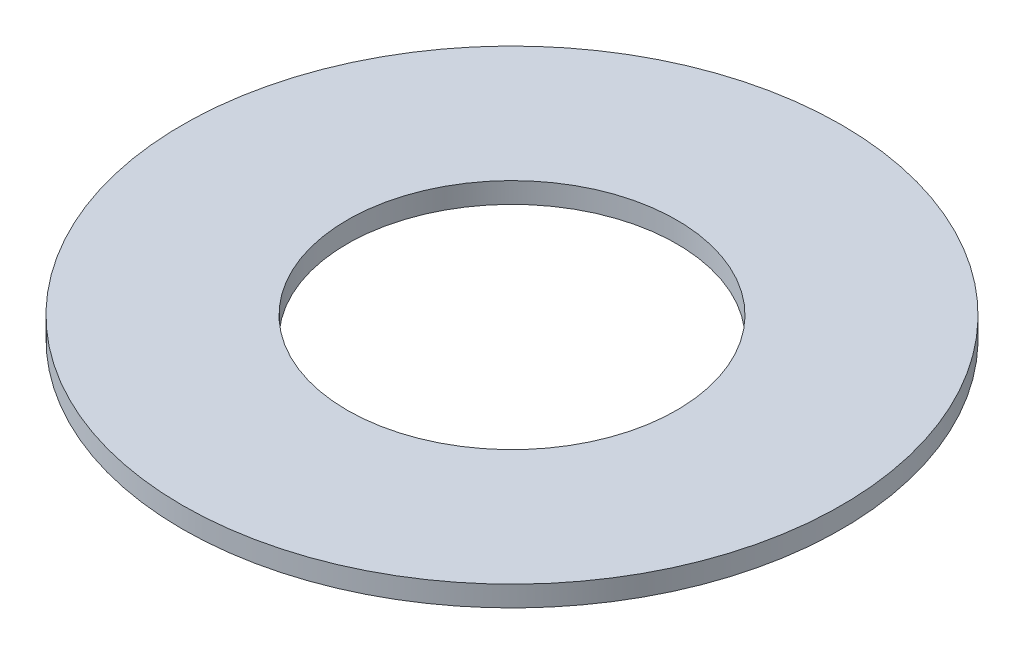
ISO-10303-21;
HEADER;
FILE_DESCRIPTION(('STEP AP214'),'2;1');
FILE_NAME('part.step','',(''),(''),'','','');
FILE_SCHEMA(('AUTOMOTIVE_DESIGN { 1 0 10303 214 1 1 1 1 }'));
ENDSEC;
DATA;
#1=APPLICATION_CONTEXT('core data for automotive mechanical design processes');
#2=APPLICATION_PROTOCOL_DEFINITION('international standard','automotive_design',2000,#1);
#3=PRODUCT_CONTEXT('',#1,'mechanical');
#4=PRODUCT('Part','Part','',(#3));
#5=PRODUCT_RELATED_PRODUCT_CATEGORY('part','',(#4));
#6=PRODUCT_DEFINITION_FORMATION('','',#4);
#7=PRODUCT_DEFINITION_CONTEXT('part definition',#1,'design');
#8=PRODUCT_DEFINITION('design','',#6,#7);
#9=PRODUCT_DEFINITION_SHAPE('','',#8);
#10=(LENGTH_UNIT() NAMED_UNIT(*) SI_UNIT(.MILLI.,.METRE.));
#11=(NAMED_UNIT(*) PLANE_ANGLE_UNIT() SI_UNIT($,.RADIAN.));
#12=(NAMED_UNIT(*) SI_UNIT($,.STERADIAN.) SOLID_ANGLE_UNIT());
#13=UNCERTAINTY_MEASURE_WITH_UNIT(LENGTH_MEASURE(1.E-05),#10,'distance_accuracy_value','');
#14=(GEOMETRIC_REPRESENTATION_CONTEXT(3) GLOBAL_UNCERTAINTY_ASSIGNED_CONTEXT((#13)) GLOBAL_UNIT_ASSIGNED_CONTEXT((#10,
#11,#12)) REPRESENTATION_CONTEXT('',''));
#15=CARTESIAN_POINT('',(0.,0.,0.));
#16=DIRECTION('',(0.,0.,1.));
#17=DIRECTION('',(1.,0.,0.));
#18=AXIS2_PLACEMENT_3D('',#15,#16,#17);
#19=CARTESIAN_POINT('',(0.,2.,0.));
#20=DIRECTION('',(0.,1.,0.));
#21=DIRECTION('',(0.,0.,1.));
#22=AXIS2_PLACEMENT_3D('',#19,#20,#21);
#23=CYLINDRICAL_SURFACE('',#22,32.);
#24=CARTESIAN_POINT('',(0.,4.,0.));
#25=DIRECTION('',(0.,1.,0.));
#26=DIRECTION('',(0.,0.,1.));
#27=AXIS2_PLACEMENT_3D('',#24,#25,#26);
#28=CIRCLE('',#27,32.);
#29=CARTESIAN_POINT('',(0.,4.,32.));
#30=VERTEX_POINT('',#29);
#31=EDGE_CURVE('E45',#30,#30,#28,.T.);
#32=ORIENTED_EDGE('',*,*,#31,.F.);
#33=EDGE_LOOP('',(#32));
#34=FACE_BOUND('',#33,.T.);
#35=CARTESIAN_POINT('',(0.,2.,0.));
#36=DIRECTION('',(0.,1.,0.));
#37=DIRECTION('',(0.,0.,1.));
#38=AXIS2_PLACEMENT_3D('',#35,#36,#37);
#39=CIRCLE('',#38,32.);
#40=CARTESIAN_POINT('',(0.,2.,32.));
#41=VERTEX_POINT('',#40);
#42=EDGE_CURVE('E51',#41,#41,#39,.T.);
#43=ORIENTED_EDGE('',*,*,#42,.T.);
#44=EDGE_LOOP('',(#43));
#45=FACE_BOUND('',#44,.T.);
#46=ADVANCED_FACE('F37',(#34,#45),#23,.T.);
#47=CARTESIAN_POINT('',(0.,2.,0.));
#48=DIRECTION('',(0.,1.,0.));
#49=DIRECTION('',(0.,0.,1.));
#50=AXIS2_PLACEMENT_3D('',#47,#48,#49);
#51=CYLINDRICAL_SURFACE('',#50,16.);
#52=CARTESIAN_POINT('',(0.,4.,0.));
#53=DIRECTION('',(0.,1.,0.));
#54=DIRECTION('',(0.,0.,1.));
#55=AXIS2_PLACEMENT_3D('',#52,#53,#54);
#56=CIRCLE('',#55,16.);
#57=CARTESIAN_POINT('',(0.,4.,16.));
#58=VERTEX_POINT('',#57);
#59=EDGE_CURVE('E10',#58,#58,#56,.T.);
#60=ORIENTED_EDGE('',*,*,#59,.T.);
#61=EDGE_LOOP('',(#60));
#62=FACE_BOUND('',#61,.T.);
#63=CARTESIAN_POINT('',(0.,2.,0.));
#64=DIRECTION('',(0.,1.,0.));
#65=DIRECTION('',(0.,0.,1.));
#66=AXIS2_PLACEMENT_3D('',#63,#64,#65);
#67=CIRCLE('',#66,16.);
#68=CARTESIAN_POINT('',(0.,2.,16.));
#69=VERTEX_POINT('',#68);
#70=EDGE_CURVE('E41',#69,#69,#67,.T.);
#71=ORIENTED_EDGE('',*,*,#70,.F.);
#72=EDGE_LOOP('',(#71));
#73=FACE_BOUND('',#72,.T.);
#74=ADVANCED_FACE('F39',(#62,#73),#51,.F.);
#75=CARTESIAN_POINT('',(0.,4.,0.));
#76=DIRECTION('',(0.,1.,0.));
#77=DIRECTION('',(0.,0.,1.));
#78=AXIS2_PLACEMENT_3D('',#75,#76,#77);
#79=PLANE('',#78);
#80=ORIENTED_EDGE('',*,*,#31,.T.);
#81=EDGE_LOOP('',(#80));
#82=FACE_BOUND('',#81,.T.);
#83=ORIENTED_EDGE('',*,*,#59,.F.);
#84=EDGE_LOOP('',(#83));
#85=FACE_BOUND('',#84,.T.);
#86=ADVANCED_FACE('F61',(#82,#85),#79,.T.);
#87=CARTESIAN_POINT('',(0.,2.,0.));
#88=DIRECTION('',(0.,1.,0.));
#89=DIRECTION('',(0.,0.,1.));
#90=AXIS2_PLACEMENT_3D('',#87,#88,#89);
#91=PLANE('',#90);
#92=ORIENTED_EDGE('',*,*,#42,.F.);
#93=EDGE_LOOP('',(#92));
#94=FACE_BOUND('',#93,.T.);
#95=ORIENTED_EDGE('',*,*,#70,.T.);
#96=EDGE_LOOP('',(#95));
#97=FACE_BOUND('',#96,.T.);
#98=ADVANCED_FACE('F58',(#94,#97),#91,.F.);
#99=CLOSED_SHELL('',(#46,#74,#86,#98));
#100=MANIFOLD_SOLID_BREP('B2',#99);
#101=ADVANCED_BREP_SHAPE_REPRESENTATION('',(#18,#100),#14);
#102=SHAPE_DEFINITION_REPRESENTATION(#9,#101);
ENDSEC;
END-ISO-10303-21;
